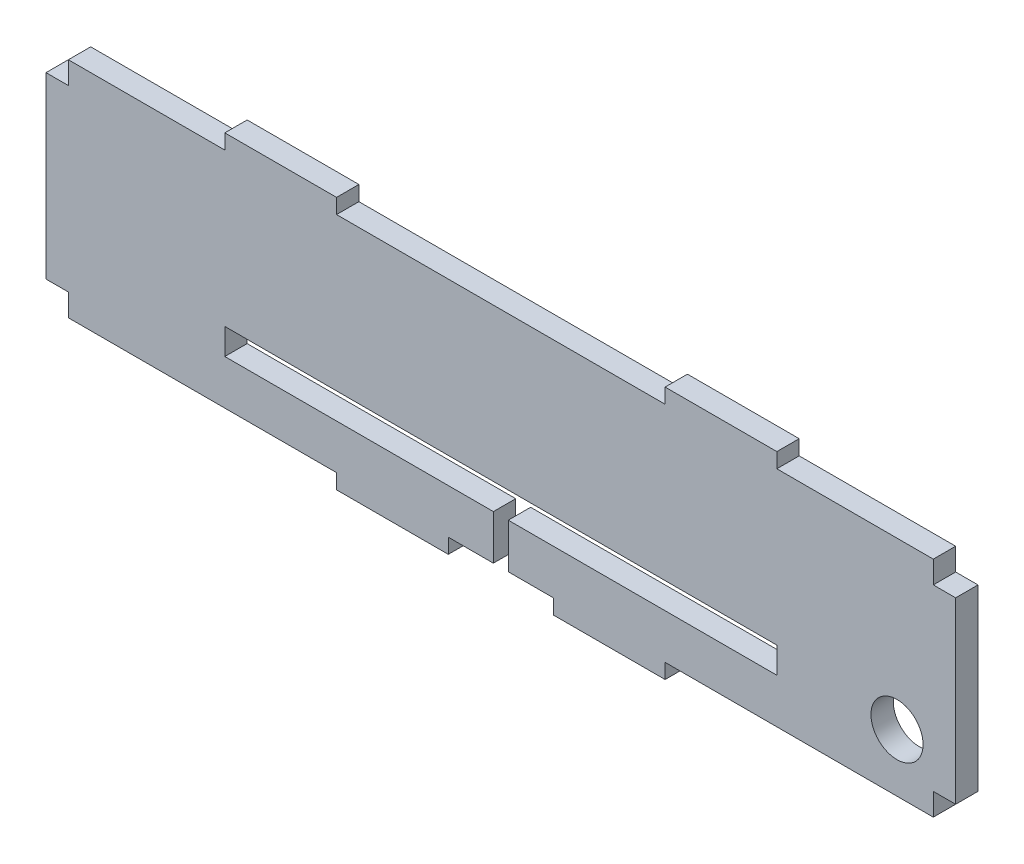
ISO-10303-21;
HEADER;
FILE_DESCRIPTION(('STEP AP214'),'2;1');
FILE_NAME('part.step','',(''),(''),'','','');
FILE_SCHEMA(('AUTOMOTIVE_DESIGN { 1 0 10303 214 1 1 1 1 }'));
ENDSEC;
DATA;
#1=APPLICATION_CONTEXT('core data for automotive mechanical design processes');
#2=APPLICATION_PROTOCOL_DEFINITION('international standard','automotive_design',2000,#1);
#3=PRODUCT_CONTEXT('',#1,'mechanical');
#4=PRODUCT('Part','Part','',(#3));
#5=PRODUCT_RELATED_PRODUCT_CATEGORY('part','',(#4));
#6=PRODUCT_DEFINITION_FORMATION('','',#4);
#7=PRODUCT_DEFINITION_CONTEXT('part definition',#1,'design');
#8=PRODUCT_DEFINITION('design','',#6,#7);
#9=PRODUCT_DEFINITION_SHAPE('','',#8);
#10=(LENGTH_UNIT() NAMED_UNIT(*) SI_UNIT(.MILLI.,.METRE.));
#11=(NAMED_UNIT(*) PLANE_ANGLE_UNIT() SI_UNIT($,.RADIAN.));
#12=(NAMED_UNIT(*) SI_UNIT($,.STERADIAN.) SOLID_ANGLE_UNIT());
#13=UNCERTAINTY_MEASURE_WITH_UNIT(LENGTH_MEASURE(1.E-05),#10,'distance_accuracy_value','');
#14=(GEOMETRIC_REPRESENTATION_CONTEXT(3) GLOBAL_UNCERTAINTY_ASSIGNED_CONTEXT((#13)) GLOBAL_UNIT_ASSIGNED_CONTEXT((#10,
#11,#12)) REPRESENTATION_CONTEXT('',''));
#15=CARTESIAN_POINT('',(0.,0.,0.));
#16=DIRECTION('',(0.,0.,1.));
#17=DIRECTION('',(1.,0.,0.));
#18=AXIS2_PLACEMENT_3D('',#15,#16,#17);
#19=CARTESIAN_POINT('',(0.,30.,3.));
#20=DIRECTION('',(0.,1.,0.));
#21=DIRECTION('',(0.,0.,1.));
#22=AXIS2_PLACEMENT_3D('',#19,#20,#21);
#23=PLANE('',#22);
#24=DIRECTION('',(1.,0.,0.));
#25=VECTOR('',#24,1.);
#26=CARTESIAN_POINT('',(0.,30.,0.));
#27=LINE('',#26,#25);
#28=CARTESIAN_POINT('',(6.00000000000002,30.,0.));
#29=VERTEX_POINT('',#28);
#30=CARTESIAN_POINT('',(27.,30.,0.));
#31=VERTEX_POINT('',#30);
#32=EDGE_CURVE('E388',#29,#31,#27,.T.);
#33=ORIENTED_EDGE('',*,*,#32,.F.);
#34=DIRECTION('',(0.,0.,-1.));
#35=VECTOR('',#34,1.);
#36=CARTESIAN_POINT('',(6.00000000000002,30.,3.));
#37=LINE('',#36,#35);
#38=CARTESIAN_POINT('',(6.00000000000002,30.,3.));
#39=VERTEX_POINT('',#38);
#40=EDGE_CURVE('E11',#39,#29,#37,.T.);
#41=ORIENTED_EDGE('',*,*,#40,.F.);
#42=DIRECTION('',(1.,0.,0.));
#43=VECTOR('',#42,1.);
#44=CARTESIAN_POINT('',(0.,30.,3.));
#45=LINE('',#44,#43);
#46=CARTESIAN_POINT('',(27.,30.,3.));
#47=VERTEX_POINT('',#46);
#48=EDGE_CURVE('E1069',#39,#47,#45,.T.);
#49=ORIENTED_EDGE('',*,*,#48,.T.);
#50=DIRECTION('',(0.,0.,-1.));
#51=VECTOR('',#50,1.);
#52=CARTESIAN_POINT('',(27.,30.,3.));
#53=LINE('',#52,#51);
#54=EDGE_CURVE('E53',#47,#31,#53,.T.);
#55=ORIENTED_EDGE('',*,*,#54,.T.);
#56=EDGE_LOOP('',(#33,#41,#49,#55));
#57=FACE_BOUND('',#56,.T.);
#58=ADVANCED_FACE('F36',(#57),#23,.T.);
#59=CARTESIAN_POINT('',(6.00000000000002,0.,3.));
#60=DIRECTION('',(1.,0.,0.));
#61=DIRECTION('',(0.,0.,-1.));
#62=AXIS2_PLACEMENT_3D('',#59,#60,#61);
#63=PLANE('',#62);
#64=DIRECTION('',(0.,-1.,0.));
#65=VECTOR('',#64,1.);
#66=CARTESIAN_POINT('',(6.00000000000002,0.,0.));
#67=LINE('',#66,#65);
#68=CARTESIAN_POINT('',(6.00000000000002,27.,0.));
#69=VERTEX_POINT('',#68);
#70=EDGE_CURVE('E385',#29,#69,#67,.T.);
#71=ORIENTED_EDGE('',*,*,#70,.T.);
#72=DIRECTION('',(0.,0.,-1.));
#73=VECTOR('',#72,1.);
#74=CARTESIAN_POINT('',(6.00000000000002,27.,3.));
#75=LINE('',#74,#73);
#76=CARTESIAN_POINT('',(6.00000000000002,27.,3.));
#77=VERTEX_POINT('',#76);
#78=EDGE_CURVE('E45',#77,#69,#75,.T.);
#79=ORIENTED_EDGE('',*,*,#78,.F.);
#80=DIRECTION('',(0.,-1.,0.));
#81=VECTOR('',#80,1.);
#82=CARTESIAN_POINT('',(6.00000000000002,0.,3.));
#83=LINE('',#82,#81);
#84=EDGE_CURVE('E1067',#39,#77,#83,.T.);
#85=ORIENTED_EDGE('',*,*,#84,.F.);
#86=ORIENTED_EDGE('',*,*,#40,.T.);
#87=EDGE_LOOP('',(#71,#79,#85,#86));
#88=FACE_BOUND('',#87,.T.);
#89=ADVANCED_FACE('F386',(#88),#63,.F.);
#90=CARTESIAN_POINT('',(0.,27.,3.));
#91=DIRECTION('',(0.,1.,0.));
#92=DIRECTION('',(0.,0.,1.));
#93=AXIS2_PLACEMENT_3D('',#90,#91,#92);
#94=PLANE('',#93);
#95=DIRECTION('',(1.,0.,0.));
#96=VECTOR('',#95,1.);
#97=CARTESIAN_POINT('',(0.,27.,0.));
#98=LINE('',#97,#96);
#99=CARTESIAN_POINT('',(3.00000000000002,27.,0.));
#100=VERTEX_POINT('',#99);
#101=EDGE_CURVE('E379',#100,#69,#98,.T.);
#102=ORIENTED_EDGE('',*,*,#101,.F.);
#103=DIRECTION('',(0.,0.,-1.));
#104=VECTOR('',#103,1.);
#105=CARTESIAN_POINT('',(3.00000000000002,27.,3.));
#106=LINE('',#105,#104);
#107=CARTESIAN_POINT('',(3.00000000000002,27.,3.));
#108=VERTEX_POINT('',#107);
#109=EDGE_CURVE('E371',#108,#100,#106,.T.);
#110=ORIENTED_EDGE('',*,*,#109,.F.);
#111=DIRECTION('',(1.,0.,0.));
#112=VECTOR('',#111,1.);
#113=CARTESIAN_POINT('',(0.,27.,3.));
#114=LINE('',#113,#112);
#115=EDGE_CURVE('E382',#108,#77,#114,.T.);
#116=ORIENTED_EDGE('',*,*,#115,.T.);
#117=ORIENTED_EDGE('',*,*,#78,.T.);
#118=EDGE_LOOP('',(#102,#110,#116,#117));
#119=FACE_BOUND('',#118,.T.);
#120=ADVANCED_FACE('F377',(#119),#94,.T.);
#121=CARTESIAN_POINT('',(3.00000000000002,0.,3.));
#122=DIRECTION('',(-1.,0.,0.));
#123=DIRECTION('',(0.,0.,1.));
#124=AXIS2_PLACEMENT_3D('',#121,#122,#123);
#125=PLANE('',#124);
#126=DIRECTION('',(0.,1.,0.));
#127=VECTOR('',#126,1.);
#128=CARTESIAN_POINT('',(3.00000000000002,0.,0.));
#129=LINE('',#128,#127);
#130=CARTESIAN_POINT('',(3.00000000000002,3.,0.));
#131=VERTEX_POINT('',#130);
#132=EDGE_CURVE('E393',#131,#100,#129,.T.);
#133=ORIENTED_EDGE('',*,*,#132,.F.);
#134=DIRECTION('',(0.,0.,-1.));
#135=VECTOR('',#134,1.);
#136=CARTESIAN_POINT('',(3.00000000000002,3.,3.));
#137=LINE('',#136,#135);
#138=CARTESIAN_POINT('',(3.00000000000002,3.,3.));
#139=VERTEX_POINT('',#138);
#140=EDGE_CURVE('E369',#139,#131,#137,.T.);
#141=ORIENTED_EDGE('',*,*,#140,.F.);
#142=DIRECTION('',(0.,1.,0.));
#143=VECTOR('',#142,1.);
#144=CARTESIAN_POINT('',(3.00000000000002,0.,3.));
#145=LINE('',#144,#143);
#146=EDGE_CURVE('E1063',#139,#108,#145,.T.);
#147=ORIENTED_EDGE('',*,*,#146,.T.);
#148=ORIENTED_EDGE('',*,*,#109,.T.);
#149=EDGE_LOOP('',(#133,#141,#147,#148));
#150=FACE_BOUND('',#149,.T.);
#151=ADVANCED_FACE('F513',(#150),#125,.T.);
#152=CARTESIAN_POINT('',(0.,3.,3.));
#153=DIRECTION('',(0.,1.,0.));
#154=DIRECTION('',(0.,0.,1.));
#155=AXIS2_PLACEMENT_3D('',#152,#153,#154);
#156=PLANE('',#155);
#157=DIRECTION('',(1.,0.,0.));
#158=VECTOR('',#157,1.);
#159=CARTESIAN_POINT('',(0.,3.,0.));
#160=LINE('',#159,#158);
#161=CARTESIAN_POINT('',(6.00000000000002,3.,0.));
#162=VERTEX_POINT('',#161);
#163=EDGE_CURVE('E395',#131,#162,#160,.T.);
#164=ORIENTED_EDGE('',*,*,#163,.T.);
#165=DIRECTION('',(0.,0.,-1.));
#166=VECTOR('',#165,1.);
#167=CARTESIAN_POINT('',(6.00000000000002,3.,3.));
#168=LINE('',#167,#166);
#169=CARTESIAN_POINT('',(6.00000000000002,3.,3.));
#170=VERTEX_POINT('',#169);
#171=EDGE_CURVE('E367',#170,#162,#168,.T.);
#172=ORIENTED_EDGE('',*,*,#171,.F.);
#173=DIRECTION('',(1.,0.,0.));
#174=VECTOR('',#173,1.);
#175=CARTESIAN_POINT('',(0.,3.,3.));
#176=LINE('',#175,#174);
#177=EDGE_CURVE('E1061',#139,#170,#176,.T.);
#178=ORIENTED_EDGE('',*,*,#177,.F.);
#179=ORIENTED_EDGE('',*,*,#140,.T.);
#180=EDGE_LOOP('',(#164,#172,#178,#179));
#181=FACE_BOUND('',#180,.T.);
#182=ADVANCED_FACE('F516',(#181),#156,.F.);
#183=CARTESIAN_POINT('',(6.00000000000002,0.,3.));
#184=DIRECTION('',(-1.,0.,0.));
#185=DIRECTION('',(0.,0.,1.));
#186=AXIS2_PLACEMENT_3D('',#183,#184,#185);
#187=PLANE('',#186);
#188=DIRECTION('',(0.,1.,0.));
#189=VECTOR('',#188,1.);
#190=CARTESIAN_POINT('',(6.00000000000002,0.,0.));
#191=LINE('',#190,#189);
#192=CARTESIAN_POINT('',(6.00000000000002,0.,0.));
#193=VERTEX_POINT('',#192);
#194=EDGE_CURVE('E401',#193,#162,#191,.T.);
#195=ORIENTED_EDGE('',*,*,#194,.F.);
#196=DIRECTION('',(0.,0.,-1.));
#197=VECTOR('',#196,1.);
#198=CARTESIAN_POINT('',(6.00000000000002,0.,3.));
#199=LINE('',#198,#197);
#200=CARTESIAN_POINT('',(6.00000000000002,0.,3.));
#201=VERTEX_POINT('',#200);
#202=EDGE_CURVE('E365',#201,#193,#199,.T.);
#203=ORIENTED_EDGE('',*,*,#202,.F.);
#204=DIRECTION('',(0.,1.,0.));
#205=VECTOR('',#204,1.);
#206=CARTESIAN_POINT('',(6.00000000000002,0.,3.));
#207=LINE('',#206,#205);
#208=EDGE_CURVE('E1058',#201,#170,#207,.T.);
#209=ORIENTED_EDGE('',*,*,#208,.T.);
#210=ORIENTED_EDGE('',*,*,#171,.T.);
#211=EDGE_LOOP('',(#195,#203,#209,#210));
#212=FACE_BOUND('',#211,.T.);
#213=ADVANCED_FACE('F520',(#212),#187,.T.);
#214=CARTESIAN_POINT('',(0.,0.,3.));
#215=DIRECTION('',(0.,1.,0.));
#216=DIRECTION('',(0.,0.,1.));
#217=AXIS2_PLACEMENT_3D('',#214,#215,#216);
#218=PLANE('',#217);
#219=DIRECTION('',(1.,0.,0.));
#220=VECTOR('',#219,1.);
#221=CARTESIAN_POINT('',(0.,0.,0.));
#222=LINE('',#221,#220);
#223=CARTESIAN_POINT('',(42.,0.,0.));
#224=VERTEX_POINT('',#223);
#225=EDGE_CURVE('E404',#193,#224,#222,.T.);
#226=ORIENTED_EDGE('',*,*,#225,.T.);
#227=DIRECTION('',(0.,0.,-1.));
#228=VECTOR('',#227,1.);
#229=CARTESIAN_POINT('',(42.,0.,3.));
#230=LINE('',#229,#228);
#231=CARTESIAN_POINT('',(42.,0.,3.));
#232=VERTEX_POINT('',#231);
#233=EDGE_CURVE('E362',#232,#224,#230,.T.);
#234=ORIENTED_EDGE('',*,*,#233,.F.);
#235=DIRECTION('',(1.,0.,0.));
#236=VECTOR('',#235,1.);
#237=CARTESIAN_POINT('',(0.,0.,3.));
#238=LINE('',#237,#236);
#239=EDGE_CURVE('E1055',#201,#232,#238,.T.);
#240=ORIENTED_EDGE('',*,*,#239,.F.);
#241=ORIENTED_EDGE('',*,*,#202,.T.);
#242=EDGE_LOOP('',(#226,#234,#240,#241));
#243=FACE_BOUND('',#242,.T.);
#244=ADVANCED_FACE('F524',(#243),#218,.F.);
#245=CARTESIAN_POINT('',(42.,2.91433543964104E-13,3.));
#246=DIRECTION('',(1.,0.,0.));
#247=DIRECTION('',(0.,1.,0.));
#248=AXIS2_PLACEMENT_3D('',#245,#246,#247);
#249=PLANE('',#248);
#250=DIRECTION('',(0.,-1.,0.));
#251=VECTOR('',#250,1.);
#252=CARTESIAN_POINT('',(42.,2.91433543964104E-13,0.));
#253=LINE('',#252,#251);
#254=CARTESIAN_POINT('',(42.,-2.,0.));
#255=VERTEX_POINT('',#254);
#256=EDGE_CURVE('E407',#224,#255,#253,.T.);
#257=ORIENTED_EDGE('',*,*,#256,.T.);
#258=DIRECTION('',(0.,0.,-1.));
#259=VECTOR('',#258,1.);
#260=CARTESIAN_POINT('',(42.,-2.,3.));
#261=LINE('',#260,#259);
#262=CARTESIAN_POINT('',(42.,-2.,3.));
#263=VERTEX_POINT('',#262);
#264=EDGE_CURVE('E359',#263,#255,#261,.T.);
#265=ORIENTED_EDGE('',*,*,#264,.F.);
#266=DIRECTION('',(0.,-1.,0.));
#267=VECTOR('',#266,1.);
#268=CARTESIAN_POINT('',(42.,2.91433543964104E-13,3.));
#269=LINE('',#268,#267);
#270=EDGE_CURVE('E1052',#232,#263,#269,.T.);
#271=ORIENTED_EDGE('',*,*,#270,.F.);
#272=ORIENTED_EDGE('',*,*,#233,.T.);
#273=EDGE_LOOP('',(#257,#265,#271,#272));
#274=FACE_BOUND('',#273,.T.);
#275=ADVANCED_FACE('F528',(#274),#249,.F.);
#276=CARTESIAN_POINT('',(0.,-2.,3.));
#277=DIRECTION('',(0.,1.,0.));
#278=DIRECTION('',(-1.,0.,0.));
#279=AXIS2_PLACEMENT_3D('',#276,#277,#278);
#280=PLANE('',#279);
#281=DIRECTION('',(1.,0.,0.));
#282=VECTOR('',#281,1.);
#283=CARTESIAN_POINT('',(0.,-2.,0.));
#284=LINE('',#283,#282);
#285=CARTESIAN_POINT('',(57.,-2.,0.));
#286=VERTEX_POINT('',#285);
#287=EDGE_CURVE('E410',#255,#286,#284,.T.);
#288=ORIENTED_EDGE('',*,*,#287,.T.);
#289=DIRECTION('',(0.,0.,-1.));
#290=VECTOR('',#289,1.);
#291=CARTESIAN_POINT('',(57.,-2.,3.));
#292=LINE('',#291,#290);
#293=CARTESIAN_POINT('',(57.,-2.,3.));
#294=VERTEX_POINT('',#293);
#295=EDGE_CURVE('E356',#294,#286,#292,.T.);
#296=ORIENTED_EDGE('',*,*,#295,.F.);
#297=DIRECTION('',(1.,0.,0.));
#298=VECTOR('',#297,1.);
#299=CARTESIAN_POINT('',(0.,-2.,3.));
#300=LINE('',#299,#298);
#301=EDGE_CURVE('E960',#263,#294,#300,.T.);
#302=ORIENTED_EDGE('',*,*,#301,.F.);
#303=ORIENTED_EDGE('',*,*,#264,.T.);
#304=EDGE_LOOP('',(#288,#296,#302,#303));
#305=FACE_BOUND('',#304,.T.);
#306=ADVANCED_FACE('F532',(#305),#280,.F.);
#307=CARTESIAN_POINT('',(57.,0.,3.));
#308=DIRECTION('',(-1.,0.,0.));
#309=DIRECTION('',(0.,0.,1.));
#310=AXIS2_PLACEMENT_3D('',#307,#308,#309);
#311=PLANE('',#310);
#312=DIRECTION('',(0.,1.,0.));
#313=VECTOR('',#312,1.);
#314=CARTESIAN_POINT('',(57.,0.,0.));
#315=LINE('',#314,#313);
#316=CARTESIAN_POINT('',(57.,0.,0.));
#317=VERTEX_POINT('',#316);
#318=EDGE_CURVE('E413',#286,#317,#315,.T.);
#319=ORIENTED_EDGE('',*,*,#318,.T.);
#320=DIRECTION('',(0.,0.,-1.));
#321=VECTOR('',#320,1.);
#322=CARTESIAN_POINT('',(57.,0.,3.));
#323=LINE('',#322,#321);
#324=CARTESIAN_POINT('',(57.,0.,3.));
#325=VERTEX_POINT('',#324);
#326=EDGE_CURVE('E353',#325,#317,#323,.T.);
#327=ORIENTED_EDGE('',*,*,#326,.F.);
#328=DIRECTION('',(0.,1.,0.));
#329=VECTOR('',#328,1.);
#330=CARTESIAN_POINT('',(57.,0.,3.));
#331=LINE('',#330,#329);
#332=EDGE_CURVE('E957',#294,#325,#331,.T.);
#333=ORIENTED_EDGE('',*,*,#332,.F.);
#334=ORIENTED_EDGE('',*,*,#295,.T.);
#335=EDGE_LOOP('',(#319,#327,#333,#334));
#336=FACE_BOUND('',#335,.T.);
#337=ADVANCED_FACE('F536',(#336),#311,.F.);
#338=CARTESIAN_POINT('',(0.,0.,3.));
#339=DIRECTION('',(0.,1.,0.));
#340=DIRECTION('',(-1.,0.,0.));
#341=AXIS2_PLACEMENT_3D('',#338,#339,#340);
#342=PLANE('',#341);
#343=DIRECTION('',(1.,0.,0.));
#344=VECTOR('',#343,1.);
#345=CARTESIAN_POINT('',(0.,0.,0.));
#346=LINE('',#345,#344);
#347=CARTESIAN_POINT('',(63.05,0.,0.));
#348=VERTEX_POINT('',#347);
#349=EDGE_CURVE('E416',#317,#348,#346,.T.);
#350=ORIENTED_EDGE('',*,*,#349,.T.);
#351=DIRECTION('',(0.,0.,-1.));
#352=VECTOR('',#351,1.);
#353=CARTESIAN_POINT('',(63.05,0.,3.));
#354=LINE('',#353,#352);
#355=CARTESIAN_POINT('',(63.05,0.,3.));
#356=VERTEX_POINT('',#355);
#357=EDGE_CURVE('E350',#356,#348,#354,.T.);
#358=ORIENTED_EDGE('',*,*,#357,.F.);
#359=DIRECTION('',(1.,0.,0.));
#360=VECTOR('',#359,1.);
#361=CARTESIAN_POINT('',(0.,0.,3.));
#362=LINE('',#361,#360);
#363=EDGE_CURVE('E953',#325,#356,#362,.T.);
#364=ORIENTED_EDGE('',*,*,#363,.F.);
#365=ORIENTED_EDGE('',*,*,#326,.T.);
#366=EDGE_LOOP('',(#350,#358,#364,#365));
#367=FACE_BOUND('',#366,.T.);
#368=ADVANCED_FACE('F540',(#367),#342,.F.);
#369=CARTESIAN_POINT('',(63.05,0.,3.));
#370=DIRECTION('',(-1.,0.,0.));
#371=DIRECTION('',(0.,0.,1.));
#372=AXIS2_PLACEMENT_3D('',#369,#370,#371);
#373=PLANE('',#372);
#374=DIRECTION('',(0.,1.,0.));
#375=VECTOR('',#374,1.);
#376=CARTESIAN_POINT('',(63.05,0.,0.));
#377=LINE('',#376,#375);
#378=CARTESIAN_POINT('',(63.05,6.,0.));
#379=VERTEX_POINT('',#378);
#380=EDGE_CURVE('E419',#348,#379,#377,.T.);
#381=ORIENTED_EDGE('',*,*,#380,.T.);
#382=DIRECTION('',(0.,0.,-1.));
#383=VECTOR('',#382,1.);
#384=CARTESIAN_POINT('',(63.05,6.,3.));
#385=LINE('',#384,#383);
#386=CARTESIAN_POINT('',(63.05,6.,3.));
#387=VERTEX_POINT('',#386);
#388=EDGE_CURVE('E348',#387,#379,#385,.T.);
#389=ORIENTED_EDGE('',*,*,#388,.F.);
#390=DIRECTION('',(0.,1.,0.));
#391=VECTOR('',#390,1.);
#392=CARTESIAN_POINT('',(63.05,0.,3.));
#393=LINE('',#392,#391);
#394=EDGE_CURVE('E948',#356,#387,#393,.T.);
#395=ORIENTED_EDGE('',*,*,#394,.F.);
#396=ORIENTED_EDGE('',*,*,#357,.T.);
#397=EDGE_LOOP('',(#381,#389,#395,#396));
#398=FACE_BOUND('',#397,.T.);
#399=ADVANCED_FACE('F542',(#398),#373,.F.);
#400=CARTESIAN_POINT('',(0.,6.,3.));
#401=DIRECTION('',(0.,1.,0.));
#402=DIRECTION('',(0.,0.,1.));
#403=AXIS2_PLACEMENT_3D('',#400,#401,#402);
#404=PLANE('',#403);
#405=DIRECTION('',(1.,0.,0.));
#406=VECTOR('',#405,1.);
#407=CARTESIAN_POINT('',(0.,6.,0.));
#408=LINE('',#407,#406);
#409=CARTESIAN_POINT('',(27.,6.,0.));
#410=VERTEX_POINT('',#409);
#411=EDGE_CURVE('E423',#410,#379,#408,.T.);
#412=ORIENTED_EDGE('',*,*,#411,.F.);
#413=DIRECTION('',(0.,0.,-1.));
#414=VECTOR('',#413,1.);
#415=CARTESIAN_POINT('',(27.,6.,3.));
#416=LINE('',#415,#414);
#417=CARTESIAN_POINT('',(27.,6.,3.));
#418=VERTEX_POINT('',#417);
#419=EDGE_CURVE('E346',#418,#410,#416,.T.);
#420=ORIENTED_EDGE('',*,*,#419,.F.);
#421=DIRECTION('',(1.,0.,0.));
#422=VECTOR('',#421,1.);
#423=CARTESIAN_POINT('',(0.,6.,3.));
#424=LINE('',#423,#422);
#425=EDGE_CURVE('E952',#418,#387,#424,.T.);
#426=ORIENTED_EDGE('',*,*,#425,.T.);
#427=ORIENTED_EDGE('',*,*,#388,.T.);
#428=EDGE_LOOP('',(#412,#420,#426,#427));
#429=FACE_BOUND('',#428,.T.);
#430=ADVANCED_FACE('F545',(#429),#404,.T.);
#431=CARTESIAN_POINT('',(27.,0.,3.));
#432=DIRECTION('',(1.,0.,0.));
#433=DIRECTION('',(0.,0.,-1.));
#434=AXIS2_PLACEMENT_3D('',#431,#432,#433);
#435=PLANE('',#434);
#436=DIRECTION('',(0.,-1.,0.));
#437=VECTOR('',#436,1.);
#438=CARTESIAN_POINT('',(27.,0.,0.));
#439=LINE('',#438,#437);
#440=CARTESIAN_POINT('',(27.,9.5,0.));
#441=VERTEX_POINT('',#440);
#442=EDGE_CURVE('E426',#441,#410,#439,.T.);
#443=ORIENTED_EDGE('',*,*,#442,.F.);
#444=DIRECTION('',(0.,0.,-1.));
#445=VECTOR('',#444,1.);
#446=CARTESIAN_POINT('',(27.,9.5,3.));
#447=LINE('',#446,#445);
#448=CARTESIAN_POINT('',(27.,9.5,3.));
#449=VERTEX_POINT('',#448);
#450=EDGE_CURVE('E344',#449,#441,#447,.T.);
#451=ORIENTED_EDGE('',*,*,#450,.F.);
#452=DIRECTION('',(0.,-1.,0.));
#453=VECTOR('',#452,1.);
#454=CARTESIAN_POINT('',(27.,0.,3.));
#455=LINE('',#454,#453);
#456=EDGE_CURVE('E1045',#449,#418,#455,.T.);
#457=ORIENTED_EDGE('',*,*,#456,.T.);
#458=ORIENTED_EDGE('',*,*,#419,.T.);
#459=EDGE_LOOP('',(#443,#451,#457,#458));
#460=FACE_BOUND('',#459,.T.);
#461=ADVANCED_FACE('F549',(#460),#435,.T.);
#462=CARTESIAN_POINT('',(0.,9.5,3.));
#463=DIRECTION('',(0.,1.,0.));
#464=DIRECTION('',(0.,0.,1.));
#465=AXIS2_PLACEMENT_3D('',#462,#463,#464);
#466=PLANE('',#465);
#467=DIRECTION('',(1.,0.,0.));
#468=VECTOR('',#467,1.);
#469=CARTESIAN_POINT('',(0.,9.5,0.));
#470=LINE('',#469,#468);
#471=CARTESIAN_POINT('',(101.1,9.5,0.));
#472=VERTEX_POINT('',#471);
#473=EDGE_CURVE('E429',#441,#472,#470,.T.);
#474=ORIENTED_EDGE('',*,*,#473,.T.);
#475=DIRECTION('',(0.,0.,-1.));
#476=VECTOR('',#475,1.);
#477=CARTESIAN_POINT('',(101.1,9.5,3.));
#478=LINE('',#477,#476);
#479=CARTESIAN_POINT('',(101.1,9.5,3.));
#480=VERTEX_POINT('',#479);
#481=EDGE_CURVE('E341',#480,#472,#478,.T.);
#482=ORIENTED_EDGE('',*,*,#481,.F.);
#483=DIRECTION('',(1.,0.,0.));
#484=VECTOR('',#483,1.);
#485=CARTESIAN_POINT('',(0.,9.5,3.));
#486=LINE('',#485,#484);
#487=EDGE_CURVE('E1047',#449,#480,#486,.T.);
#488=ORIENTED_EDGE('',*,*,#487,.F.);
#489=ORIENTED_EDGE('',*,*,#450,.T.);
#490=EDGE_LOOP('',(#474,#482,#488,#489));
#491=FACE_BOUND('',#490,.T.);
#492=ADVANCED_FACE('F553',(#491),#466,.F.);
#493=CARTESIAN_POINT('',(101.1,-4.00869813534298E-13,3.));
#494=DIRECTION('',(1.,0.,0.));
#495=DIRECTION('',(0.,1.,0.));
#496=AXIS2_PLACEMENT_3D('',#493,#494,#495);
#497=PLANE('',#496);
#498=DIRECTION('',(0.,-1.,0.));
#499=VECTOR('',#498,1.);
#500=CARTESIAN_POINT('',(101.1,-4.00869813534298E-13,0.));
#501=LINE('',#500,#499);
#502=CARTESIAN_POINT('',(101.1,6.,0.));
#503=VERTEX_POINT('',#502);
#504=EDGE_CURVE('E432',#472,#503,#501,.T.);
#505=ORIENTED_EDGE('',*,*,#504,.T.);
#506=DIRECTION('',(0.,0.,-1.));
#507=VECTOR('',#506,1.);
#508=CARTESIAN_POINT('',(101.1,6.,3.));
#509=LINE('',#508,#507);
#510=CARTESIAN_POINT('',(101.1,6.,3.));
#511=VERTEX_POINT('',#510);
#512=EDGE_CURVE('E339',#511,#503,#509,.T.);
#513=ORIENTED_EDGE('',*,*,#512,.F.);
#514=DIRECTION('',(0.,-1.,0.));
#515=VECTOR('',#514,1.);
#516=CARTESIAN_POINT('',(101.1,-4.00869813534298E-13,3.));
#517=LINE('',#516,#515);
#518=EDGE_CURVE('E975',#480,#511,#517,.T.);
#519=ORIENTED_EDGE('',*,*,#518,.F.);
#520=ORIENTED_EDGE('',*,*,#481,.T.);
#521=EDGE_LOOP('',(#505,#513,#519,#520));
#522=FACE_BOUND('',#521,.T.);
#523=ADVANCED_FACE('F557',(#522),#497,.F.);
#524=CARTESIAN_POINT('',(0.,6.,3.));
#525=DIRECTION('',(0.,1.,0.));
#526=DIRECTION('',(0.,0.,1.));
#527=AXIS2_PLACEMENT_3D('',#524,#525,#526);
#528=PLANE('',#527);
#529=DIRECTION('',(1.,0.,0.));
#530=VECTOR('',#529,1.);
#531=CARTESIAN_POINT('',(0.,6.,0.));
#532=LINE('',#531,#530);
#533=CARTESIAN_POINT('',(65.05,6.,0.));
#534=VERTEX_POINT('',#533);
#535=EDGE_CURVE('E435',#534,#503,#532,.T.);
#536=ORIENTED_EDGE('',*,*,#535,.F.);
#537=DIRECTION('',(0.,0.,-1.));
#538=VECTOR('',#537,1.);
#539=CARTESIAN_POINT('',(65.05,6.,3.));
#540=LINE('',#539,#538);
#541=CARTESIAN_POINT('',(65.05,6.,3.));
#542=VERTEX_POINT('',#541);
#543=EDGE_CURVE('E337',#542,#534,#540,.T.);
#544=ORIENTED_EDGE('',*,*,#543,.F.);
#545=DIRECTION('',(1.,0.,0.));
#546=VECTOR('',#545,1.);
#547=CARTESIAN_POINT('',(0.,6.,3.));
#548=LINE('',#547,#546);
#549=EDGE_CURVE('E972',#542,#511,#548,.T.);
#550=ORIENTED_EDGE('',*,*,#549,.T.);
#551=ORIENTED_EDGE('',*,*,#512,.T.);
#552=EDGE_LOOP('',(#536,#544,#550,#551));
#553=FACE_BOUND('',#552,.T.);
#554=ADVANCED_FACE('F561',(#553),#528,.T.);
#555=CARTESIAN_POINT('',(65.05,0.,3.));
#556=DIRECTION('',(-1.,0.,0.));
#557=DIRECTION('',(0.,0.,1.));
#558=AXIS2_PLACEMENT_3D('',#555,#556,#557);
#559=PLANE('',#558);
#560=DIRECTION('',(0.,1.,0.));
#561=VECTOR('',#560,1.);
#562=CARTESIAN_POINT('',(65.05,0.,0.));
#563=LINE('',#562,#561);
#564=CARTESIAN_POINT('',(65.05,0.,0.));
#565=VERTEX_POINT('',#564);
#566=EDGE_CURVE('E438',#565,#534,#563,.T.);
#567=ORIENTED_EDGE('',*,*,#566,.F.);
#568=DIRECTION('',(0.,0.,-1.));
#569=VECTOR('',#568,1.);
#570=CARTESIAN_POINT('',(65.05,0.,3.));
#571=LINE('',#570,#569);
#572=CARTESIAN_POINT('',(65.05,0.,3.));
#573=VERTEX_POINT('',#572);
#574=EDGE_CURVE('E335',#573,#565,#571,.T.);
#575=ORIENTED_EDGE('',*,*,#574,.F.);
#576=DIRECTION('',(0.,1.,0.));
#577=VECTOR('',#576,1.);
#578=CARTESIAN_POINT('',(65.05,0.,3.));
#579=LINE('',#578,#577);
#580=EDGE_CURVE('E964',#573,#542,#579,.T.);
#581=ORIENTED_EDGE('',*,*,#580,.T.);
#582=ORIENTED_EDGE('',*,*,#543,.T.);
#583=EDGE_LOOP('',(#567,#575,#581,#582));
#584=FACE_BOUND('',#583,.T.);
#585=ADVANCED_FACE('F565',(#584),#559,.T.);
#586=CARTESIAN_POINT('',(71.1,0.,0.));
#587=VERTEX_POINT('',#586);
#588=EDGE_CURVE('E420',#565,#587,#346,.T.);
#589=ORIENTED_EDGE('',*,*,#588,.T.);
#590=DIRECTION('',(0.,0.,-1.));
#591=VECTOR('',#590,1.);
#592=CARTESIAN_POINT('',(71.1,0.,3.));
#593=LINE('',#592,#591);
#594=CARTESIAN_POINT('',(71.1,0.,3.));
#595=VERTEX_POINT('',#594);
#596=EDGE_CURVE('E332',#595,#587,#593,.T.);
#597=ORIENTED_EDGE('',*,*,#596,.F.);
#598=EDGE_CURVE('E959',#573,#595,#362,.T.);
#599=ORIENTED_EDGE('',*,*,#598,.F.);
#600=ORIENTED_EDGE('',*,*,#574,.T.);
#601=EDGE_LOOP('',(#589,#597,#599,#600));
#602=FACE_BOUND('',#601,.T.);
#603=ADVANCED_FACE('F569',(#602),#342,.F.);
#604=CARTESIAN_POINT('',(71.1,0.,3.));
#605=DIRECTION('',(1.,0.,0.));
#606=DIRECTION('',(0.,0.,-1.));
#607=AXIS2_PLACEMENT_3D('',#604,#605,#606);
#608=PLANE('',#607);
#609=DIRECTION('',(0.,-1.,0.));
#610=VECTOR('',#609,1.);
#611=CARTESIAN_POINT('',(71.1,0.,0.));
#612=LINE('',#611,#610);
#613=CARTESIAN_POINT('',(71.1,-1.99999999999999,0.));
#614=VERTEX_POINT('',#613);
#615=EDGE_CURVE('E441',#587,#614,#612,.T.);
#616=ORIENTED_EDGE('',*,*,#615,.T.);
#617=DIRECTION('',(0.,0.,-1.));
#618=VECTOR('',#617,1.);
#619=CARTESIAN_POINT('',(71.1,-1.99999999999999,3.));
#620=LINE('',#619,#618);
#621=CARTESIAN_POINT('',(71.1,-1.99999999999999,3.));
#622=VERTEX_POINT('',#621);
#623=EDGE_CURVE('E329',#622,#614,#620,.T.);
#624=ORIENTED_EDGE('',*,*,#623,.F.);
#625=DIRECTION('',(0.,-1.,0.));
#626=VECTOR('',#625,1.);
#627=CARTESIAN_POINT('',(71.1,0.,3.));
#628=LINE('',#627,#626);
#629=EDGE_CURVE('E963',#595,#622,#628,.T.);
#630=ORIENTED_EDGE('',*,*,#629,.F.);
#631=ORIENTED_EDGE('',*,*,#596,.T.);
#632=EDGE_LOOP('',(#616,#624,#630,#631));
#633=FACE_BOUND('',#632,.T.);
#634=ADVANCED_FACE('F573',(#633),#608,.F.);
#635=CARTESIAN_POINT('',(0.,-2.,3.));
#636=DIRECTION('',(0.,1.,0.));
#637=DIRECTION('',(-1.,0.,0.));
#638=AXIS2_PLACEMENT_3D('',#635,#636,#637);
#639=PLANE('',#638);
#640=DIRECTION('',(1.,0.,0.));
#641=VECTOR('',#640,1.);
#642=CARTESIAN_POINT('',(0.,-2.,0.));
#643=LINE('',#642,#641);
#644=CARTESIAN_POINT('',(86.1,-1.99999999999998,0.));
#645=VERTEX_POINT('',#644);
#646=EDGE_CURVE('E444',#614,#645,#643,.T.);
#647=ORIENTED_EDGE('',*,*,#646,.T.);
#648=DIRECTION('',(0.,0.,-1.));
#649=VECTOR('',#648,1.);
#650=CARTESIAN_POINT('',(86.1,-1.99999999999998,3.));
#651=LINE('',#650,#649);
#652=CARTESIAN_POINT('',(86.1,-1.99999999999998,3.));
#653=VERTEX_POINT('',#652);
#654=EDGE_CURVE('E326',#653,#645,#651,.T.);
#655=ORIENTED_EDGE('',*,*,#654,.F.);
#656=DIRECTION('',(1.,0.,0.));
#657=VECTOR('',#656,1.);
#658=CARTESIAN_POINT('',(0.,-2.,3.));
#659=LINE('',#658,#657);
#660=EDGE_CURVE('E969',#622,#653,#659,.T.);
#661=ORIENTED_EDGE('',*,*,#660,.F.);
#662=ORIENTED_EDGE('',*,*,#623,.T.);
#663=EDGE_LOOP('',(#647,#655,#661,#662));
#664=FACE_BOUND('',#663,.T.);
#665=ADVANCED_FACE('F577',(#664),#639,.F.);
#666=CARTESIAN_POINT('',(86.1,0.,3.));
#667=DIRECTION('',(-1.,0.,0.));
#668=DIRECTION('',(0.,0.,1.));
#669=AXIS2_PLACEMENT_3D('',#666,#667,#668);
#670=PLANE('',#669);
#671=DIRECTION('',(0.,1.,0.));
#672=VECTOR('',#671,1.);
#673=CARTESIAN_POINT('',(86.1,0.,0.));
#674=LINE('',#673,#672);
#675=CARTESIAN_POINT('',(86.1,0.,0.));
#676=VERTEX_POINT('',#675);
#677=EDGE_CURVE('E447',#645,#676,#674,.T.);
#678=ORIENTED_EDGE('',*,*,#677,.T.);
#679=DIRECTION('',(0.,0.,-1.));
#680=VECTOR('',#679,1.);
#681=CARTESIAN_POINT('',(86.1,0.,3.));
#682=LINE('',#681,#680);
#683=CARTESIAN_POINT('',(86.1,0.,3.));
#684=VERTEX_POINT('',#683);
#685=EDGE_CURVE('E323',#684,#676,#682,.T.);
#686=ORIENTED_EDGE('',*,*,#685,.F.);
#687=DIRECTION('',(0.,1.,0.));
#688=VECTOR('',#687,1.);
#689=CARTESIAN_POINT('',(86.1,0.,3.));
#690=LINE('',#689,#688);
#691=EDGE_CURVE('E981',#653,#684,#690,.T.);
#692=ORIENTED_EDGE('',*,*,#691,.F.);
#693=ORIENTED_EDGE('',*,*,#654,.T.);
#694=EDGE_LOOP('',(#678,#686,#692,#693));
#695=FACE_BOUND('',#694,.T.);
#696=ADVANCED_FACE('F581',(#695),#670,.F.);
#697=CARTESIAN_POINT('',(0.,0.,3.));
#698=DIRECTION('',(0.,1.,0.));
#699=DIRECTION('',(-1.,0.,0.));
#700=AXIS2_PLACEMENT_3D('',#697,#698,#699);
#701=PLANE('',#700);
#702=DIRECTION('',(1.,0.,0.));
#703=VECTOR('',#702,1.);
#704=CARTESIAN_POINT('',(0.,0.,0.));
#705=LINE('',#704,#703);
#706=CARTESIAN_POINT('',(122.1,0.,0.));
#707=VERTEX_POINT('',#706);
#708=EDGE_CURVE('E450',#676,#707,#705,.T.);
#709=ORIENTED_EDGE('',*,*,#708,.T.);
#710=DIRECTION('',(0.,0.,-1.));
#711=VECTOR('',#710,1.);
#712=CARTESIAN_POINT('',(122.1,0.,3.));
#713=LINE('',#712,#711);
#714=CARTESIAN_POINT('',(122.1,0.,3.));
#715=VERTEX_POINT('',#714);
#716=EDGE_CURVE('E320',#715,#707,#713,.T.);
#717=ORIENTED_EDGE('',*,*,#716,.F.);
#718=DIRECTION('',(1.,0.,0.));
#719=VECTOR('',#718,1.);
#720=CARTESIAN_POINT('',(0.,0.,3.));
#721=LINE('',#720,#719);
#722=EDGE_CURVE('E984',#684,#715,#721,.T.);
#723=ORIENTED_EDGE('',*,*,#722,.F.);
#724=ORIENTED_EDGE('',*,*,#685,.T.);
#725=EDGE_LOOP('',(#709,#717,#723,#724));
#726=FACE_BOUND('',#725,.T.);
#727=ADVANCED_FACE('F585',(#726),#701,.F.);
#728=CARTESIAN_POINT('',(122.1,0.,3.));
#729=DIRECTION('',(-1.,0.,0.));
#730=DIRECTION('',(0.,0.,1.));
#731=AXIS2_PLACEMENT_3D('',#728,#729,#730);
#732=PLANE('',#731);
#733=DIRECTION('',(0.,1.,0.));
#734=VECTOR('',#733,1.);
#735=CARTESIAN_POINT('',(122.1,0.,0.));
#736=LINE('',#735,#734);
#737=CARTESIAN_POINT('',(122.1,3.,0.));
#738=VERTEX_POINT('',#737);
#739=EDGE_CURVE('E453',#707,#738,#736,.T.);
#740=ORIENTED_EDGE('',*,*,#739,.T.);
#741=DIRECTION('',(0.,0.,-1.));
#742=VECTOR('',#741,1.);
#743=CARTESIAN_POINT('',(122.1,3.,3.));
#744=LINE('',#743,#742);
#745=CARTESIAN_POINT('',(122.1,3.,3.));
#746=VERTEX_POINT('',#745);
#747=EDGE_CURVE('E318',#746,#738,#744,.T.);
#748=ORIENTED_EDGE('',*,*,#747,.F.);
#749=DIRECTION('',(0.,1.,0.));
#750=VECTOR('',#749,1.);
#751=CARTESIAN_POINT('',(122.1,0.,3.));
#752=LINE('',#751,#750);
#753=EDGE_CURVE('E987',#715,#746,#752,.T.);
#754=ORIENTED_EDGE('',*,*,#753,.F.);
#755=ORIENTED_EDGE('',*,*,#716,.T.);
#756=EDGE_LOOP('',(#740,#748,#754,#755));
#757=FACE_BOUND('',#756,.T.);
#758=ADVANCED_FACE('F589',(#757),#732,.F.);
#759=CARTESIAN_POINT('',(0.,3.,3.));
#760=DIRECTION('',(0.,-1.,0.));
#761=DIRECTION('',(0.,0.,-1.));
#762=AXIS2_PLACEMENT_3D('',#759,#760,#761);
#763=PLANE('',#762);
#764=DIRECTION('',(-1.,0.,0.));
#765=VECTOR('',#764,1.);
#766=CARTESIAN_POINT('',(0.,3.,0.));
#767=LINE('',#766,#765);
#768=CARTESIAN_POINT('',(125.1,3.,0.));
#769=VERTEX_POINT('',#768);
#770=EDGE_CURVE('E456',#769,#738,#767,.T.);
#771=ORIENTED_EDGE('',*,*,#770,.F.);
#772=DIRECTION('',(0.,0.,-1.));
#773=VECTOR('',#772,1.);
#774=CARTESIAN_POINT('',(125.1,3.,3.));
#775=LINE('',#774,#773);
#776=CARTESIAN_POINT('',(125.1,3.,3.));
#777=VERTEX_POINT('',#776);
#778=EDGE_CURVE('E316',#777,#769,#775,.T.);
#779=ORIENTED_EDGE('',*,*,#778,.F.);
#780=DIRECTION('',(-1.,0.,0.));
#781=VECTOR('',#780,1.);
#782=CARTESIAN_POINT('',(0.,3.,3.));
#783=LINE('',#782,#781);
#784=EDGE_CURVE('E989',#777,#746,#783,.T.);
#785=ORIENTED_EDGE('',*,*,#784,.T.);
#786=ORIENTED_EDGE('',*,*,#747,.T.);
#787=EDGE_LOOP('',(#771,#779,#785,#786));
#788=FACE_BOUND('',#787,.T.);
#789=ADVANCED_FACE('F593',(#788),#763,.T.);
#790=CARTESIAN_POINT('',(125.1,0.,3.));
#791=DIRECTION('',(-1.,0.,0.));
#792=DIRECTION('',(0.,0.,1.));
#793=AXIS2_PLACEMENT_3D('',#790,#791,#792);
#794=PLANE('',#793);
#795=DIRECTION('',(0.,1.,0.));
#796=VECTOR('',#795,1.);
#797=CARTESIAN_POINT('',(125.1,0.,0.));
#798=LINE('',#797,#796);
#799=CARTESIAN_POINT('',(125.1,27.,0.));
#800=VERTEX_POINT('',#799);
#801=EDGE_CURVE('E459',#769,#800,#798,.T.);
#802=ORIENTED_EDGE('',*,*,#801,.T.);
#803=DIRECTION('',(0.,0.,-1.));
#804=VECTOR('',#803,1.);
#805=CARTESIAN_POINT('',(125.1,27.,3.));
#806=LINE('',#805,#804);
#807=CARTESIAN_POINT('',(125.1,27.,3.));
#808=VERTEX_POINT('',#807);
#809=EDGE_CURVE('E313',#808,#800,#806,.T.);
#810=ORIENTED_EDGE('',*,*,#809,.F.);
#811=DIRECTION('',(0.,1.,0.));
#812=VECTOR('',#811,1.);
#813=CARTESIAN_POINT('',(125.1,0.,3.));
#814=LINE('',#813,#812);
#815=EDGE_CURVE('E992',#777,#808,#814,.T.);
#816=ORIENTED_EDGE('',*,*,#815,.F.);
#817=ORIENTED_EDGE('',*,*,#778,.T.);
#818=EDGE_LOOP('',(#802,#810,#816,#817));
#819=FACE_BOUND('',#818,.T.);
#820=ADVANCED_FACE('F597',(#819),#794,.F.);
#821=CARTESIAN_POINT('',(0.,27.,3.));
#822=DIRECTION('',(0.,-1.,0.));
#823=DIRECTION('',(0.,0.,-1.));
#824=AXIS2_PLACEMENT_3D('',#821,#822,#823);
#825=PLANE('',#824);
#826=DIRECTION('',(-1.,0.,0.));
#827=VECTOR('',#826,1.);
#828=CARTESIAN_POINT('',(0.,27.,0.));
#829=LINE('',#828,#827);
#830=CARTESIAN_POINT('',(122.1,27.,0.));
#831=VERTEX_POINT('',#830);
#832=EDGE_CURVE('E462',#800,#831,#829,.T.);
#833=ORIENTED_EDGE('',*,*,#832,.T.);
#834=DIRECTION('',(0.,0.,-1.));
#835=VECTOR('',#834,1.);
#836=CARTESIAN_POINT('',(122.1,27.,3.));
#837=LINE('',#836,#835);
#838=CARTESIAN_POINT('',(122.1,27.,3.));
#839=VERTEX_POINT('',#838);
#840=EDGE_CURVE('E311',#839,#831,#837,.T.);
#841=ORIENTED_EDGE('',*,*,#840,.F.);
#842=DIRECTION('',(-1.,0.,0.));
#843=VECTOR('',#842,1.);
#844=CARTESIAN_POINT('',(0.,27.,3.));
#845=LINE('',#844,#843);
#846=EDGE_CURVE('E995',#808,#839,#845,.T.);
#847=ORIENTED_EDGE('',*,*,#846,.F.);
#848=ORIENTED_EDGE('',*,*,#809,.T.);
#849=EDGE_LOOP('',(#833,#841,#847,#848));
#850=FACE_BOUND('',#849,.T.);
#851=ADVANCED_FACE('F601',(#850),#825,.F.);
#852=CARTESIAN_POINT('',(122.1,0.,3.));
#853=DIRECTION('',(1.,0.,0.));
#854=DIRECTION('',(0.,0.,-1.));
#855=AXIS2_PLACEMENT_3D('',#852,#853,#854);
#856=PLANE('',#855);
#857=DIRECTION('',(0.,-1.,0.));
#858=VECTOR('',#857,1.);
#859=CARTESIAN_POINT('',(122.1,0.,0.));
#860=LINE('',#859,#858);
#861=CARTESIAN_POINT('',(122.1,30.,0.));
#862=VERTEX_POINT('',#861);
#863=EDGE_CURVE('E465',#862,#831,#860,.T.);
#864=ORIENTED_EDGE('',*,*,#863,.F.);
#865=DIRECTION('',(0.,0.,-1.));
#866=VECTOR('',#865,1.);
#867=CARTESIAN_POINT('',(122.1,30.,3.));
#868=LINE('',#867,#866);
#869=CARTESIAN_POINT('',(122.1,30.,3.));
#870=VERTEX_POINT('',#869);
#871=EDGE_CURVE('E309',#870,#862,#868,.T.);
#872=ORIENTED_EDGE('',*,*,#871,.F.);
#873=DIRECTION('',(0.,-1.,0.));
#874=VECTOR('',#873,1.);
#875=CARTESIAN_POINT('',(122.1,0.,3.));
#876=LINE('',#875,#874);
#877=EDGE_CURVE('E997',#870,#839,#876,.T.);
#878=ORIENTED_EDGE('',*,*,#877,.T.);
#879=ORIENTED_EDGE('',*,*,#840,.T.);
#880=EDGE_LOOP('',(#864,#872,#878,#879));
#881=FACE_BOUND('',#880,.T.);
#882=ADVANCED_FACE('F605',(#881),#856,.T.);
#883=CARTESIAN_POINT('',(0.,30.,3.));
#884=DIRECTION('',(0.,-1.,0.));
#885=DIRECTION('',(0.,0.,-1.));
#886=AXIS2_PLACEMENT_3D('',#883,#884,#885);
#887=PLANE('',#886);
#888=DIRECTION('',(-1.,0.,0.));
#889=VECTOR('',#888,1.);
#890=CARTESIAN_POINT('',(0.,30.,0.));
#891=LINE('',#890,#889);
#892=CARTESIAN_POINT('',(101.1,30.,0.));
#893=VERTEX_POINT('',#892);
#894=EDGE_CURVE('E468',#862,#893,#891,.T.);
#895=ORIENTED_EDGE('',*,*,#894,.T.);
#896=DIRECTION('',(0.,0.,-1.));
#897=VECTOR('',#896,1.);
#898=CARTESIAN_POINT('',(101.1,30.,3.));
#899=LINE('',#898,#897);
#900=CARTESIAN_POINT('',(101.1,30.,3.));
#901=VERTEX_POINT('',#900);
#902=EDGE_CURVE('E306',#901,#893,#899,.T.);
#903=ORIENTED_EDGE('',*,*,#902,.F.);
#904=DIRECTION('',(-1.,0.,0.));
#905=VECTOR('',#904,1.);
#906=CARTESIAN_POINT('',(0.,30.,3.));
#907=LINE('',#906,#905);
#908=EDGE_CURVE('E1000',#870,#901,#907,.T.);
#909=ORIENTED_EDGE('',*,*,#908,.F.);
#910=ORIENTED_EDGE('',*,*,#871,.T.);
#911=EDGE_LOOP('',(#895,#903,#909,#910));
#912=FACE_BOUND('',#911,.T.);
#913=ADVANCED_FACE('F609',(#912),#887,.F.);
#914=CARTESIAN_POINT('',(101.1,7.01522173685024E-13,3.));
#915=DIRECTION('',(-1.,0.,0.));
#916=DIRECTION('',(0.,-1.,0.));
#917=AXIS2_PLACEMENT_3D('',#914,#915,#916);
#918=PLANE('',#917);
#919=DIRECTION('',(0.,1.,0.));
#920=VECTOR('',#919,1.);
#921=CARTESIAN_POINT('',(101.1,7.01522173685024E-13,0.));
#922=LINE('',#921,#920);
#923=CARTESIAN_POINT('',(101.1,32.,0.));
#924=VERTEX_POINT('',#923);
#925=EDGE_CURVE('E471',#893,#924,#922,.T.);
#926=ORIENTED_EDGE('',*,*,#925,.T.);
#927=DIRECTION('',(0.,0.,-1.));
#928=VECTOR('',#927,1.);
#929=CARTESIAN_POINT('',(101.1,32.,3.));
#930=LINE('',#929,#928);
#931=CARTESIAN_POINT('',(101.1,32.,3.));
#932=VERTEX_POINT('',#931);
#933=EDGE_CURVE('E304',#932,#924,#930,.T.);
#934=ORIENTED_EDGE('',*,*,#933,.F.);
#935=DIRECTION('',(0.,1.,0.));
#936=VECTOR('',#935,1.);
#937=CARTESIAN_POINT('',(101.1,7.01522173685024E-13,3.));
#938=LINE('',#937,#936);
#939=EDGE_CURVE('E1003',#901,#932,#938,.T.);
#940=ORIENTED_EDGE('',*,*,#939,.F.);
#941=ORIENTED_EDGE('',*,*,#902,.T.);
#942=EDGE_LOOP('',(#926,#934,#940,#941));
#943=FACE_BOUND('',#942,.T.);
#944=ADVANCED_FACE('F613',(#943),#918,.F.);
#945=CARTESIAN_POINT('',(0.,32.,3.));
#946=DIRECTION('',(0.,1.,0.));
#947=DIRECTION('',(-1.,0.,0.));
#948=AXIS2_PLACEMENT_3D('',#945,#946,#947);
#949=PLANE('',#948);
#950=DIRECTION('',(1.,0.,0.));
#951=VECTOR('',#950,1.);
#952=CARTESIAN_POINT('',(0.,32.,0.));
#953=LINE('',#952,#951);
#954=CARTESIAN_POINT('',(86.1,32.,0.));
#955=VERTEX_POINT('',#954);
#956=EDGE_CURVE('E474',#955,#924,#953,.T.);
#957=ORIENTED_EDGE('',*,*,#956,.F.);
#958=DIRECTION('',(0.,0.,-1.));
#959=VECTOR('',#958,1.);
#960=CARTESIAN_POINT('',(86.1,32.,3.));
#961=LINE('',#960,#959);
#962=CARTESIAN_POINT('',(86.1,32.,3.));
#963=VERTEX_POINT('',#962);
#964=EDGE_CURVE('E302',#963,#955,#961,.T.);
#965=ORIENTED_EDGE('',*,*,#964,.F.);
#966=DIRECTION('',(1.,0.,0.));
#967=VECTOR('',#966,1.);
#968=CARTESIAN_POINT('',(0.,32.,3.));
#969=LINE('',#968,#967);
#970=EDGE_CURVE('E1005',#963,#932,#969,.T.);
#971=ORIENTED_EDGE('',*,*,#970,.T.);
#972=ORIENTED_EDGE('',*,*,#933,.T.);
#973=EDGE_LOOP('',(#957,#965,#971,#972));
#974=FACE_BOUND('',#973,.T.);
#975=ADVANCED_FACE('F617',(#974),#949,.T.);
#976=CARTESIAN_POINT('',(86.1,0.,3.));
#977=DIRECTION('',(-1.,0.,0.));
#978=DIRECTION('',(0.,0.,1.));
#979=AXIS2_PLACEMENT_3D('',#976,#977,#978);
#980=PLANE('',#979);
#981=DIRECTION('',(0.,1.,0.));
#982=VECTOR('',#981,1.);
#983=CARTESIAN_POINT('',(86.1,0.,0.));
#984=LINE('',#983,#982);
#985=CARTESIAN_POINT('',(86.1,30.,0.));
#986=VERTEX_POINT('',#985);
#987=EDGE_CURVE('E477',#986,#955,#984,.T.);
#988=ORIENTED_EDGE('',*,*,#987,.F.);
#989=DIRECTION('',(0.,0.,-1.));
#990=VECTOR('',#989,1.);
#991=CARTESIAN_POINT('',(86.1,30.,3.));
#992=LINE('',#991,#990);
#993=CARTESIAN_POINT('',(86.1,30.,3.));
#994=VERTEX_POINT('',#993);
#995=EDGE_CURVE('E296',#994,#986,#992,.T.);
#996=ORIENTED_EDGE('',*,*,#995,.F.);
#997=DIRECTION('',(0.,1.,0.));
#998=VECTOR('',#997,1.);
#999=CARTESIAN_POINT('',(86.1,0.,3.));
#1000=LINE('',#999,#998);
#1001=EDGE_CURVE('E1008',#994,#963,#1000,.T.);
#1002=ORIENTED_EDGE('',*,*,#1001,.T.);
#1003=ORIENTED_EDGE('',*,*,#964,.T.);
#1004=EDGE_LOOP('',(#988,#996,#1002,#1003));
#1005=FACE_BOUND('',#1004,.T.);
#1006=ADVANCED_FACE('F621',(#1005),#980,.T.);
#1007=CARTESIAN_POINT('',(0.,30.,3.));
#1008=DIRECTION('',(0.,1.,0.));
#1009=DIRECTION('',(0.,0.,1.));
#1010=AXIS2_PLACEMENT_3D('',#1007,#1008,#1009);
#1011=PLANE('',#1010);
#1012=DIRECTION('',(1.,0.,0.));
#1013=VECTOR('',#1012,1.);
#1014=CARTESIAN_POINT('',(0.,30.,0.));
#1015=LINE('',#1014,#1013);
#1016=CARTESIAN_POINT('',(42.,30.,0.));
#1017=VERTEX_POINT('',#1016);
#1018=EDGE_CURVE('E480',#1017,#986,#1015,.T.);
#1019=ORIENTED_EDGE('',*,*,#1018,.F.);
#1020=DIRECTION('',(0.,0.,-1.));
#1021=VECTOR('',#1020,1.);
#1022=CARTESIAN_POINT('',(42.,30.,3.));
#1023=LINE('',#1022,#1021);
#1024=CARTESIAN_POINT('',(42.,30.,3.));
#1025=VERTEX_POINT('',#1024);
#1026=EDGE_CURVE('E294',#1025,#1017,#1023,.T.);
#1027=ORIENTED_EDGE('',*,*,#1026,.F.);
#1028=DIRECTION('',(1.,0.,0.));
#1029=VECTOR('',#1028,1.);
#1030=CARTESIAN_POINT('',(0.,30.,3.));
#1031=LINE('',#1030,#1029);
#1032=EDGE_CURVE('E288',#1025,#994,#1031,.T.);
#1033=ORIENTED_EDGE('',*,*,#1032,.T.);
#1034=ORIENTED_EDGE('',*,*,#995,.T.);
#1035=EDGE_LOOP('',(#1019,#1027,#1033,#1034));
#1036=FACE_BOUND('',#1035,.T.);
#1037=ADVANCED_FACE('F625',(#1036),#1011,.T.);
#1038=CARTESIAN_POINT('',(42.,0.,3.));
#1039=DIRECTION('',(-1.,0.,0.));
#1040=DIRECTION('',(0.,0.,1.));
#1041=AXIS2_PLACEMENT_3D('',#1038,#1039,#1040);
#1042=PLANE('',#1041);
#1043=DIRECTION('',(0.,1.,0.));
#1044=VECTOR('',#1043,1.);
#1045=CARTESIAN_POINT('',(42.,0.,0.));
#1046=LINE('',#1045,#1044);
#1047=CARTESIAN_POINT('',(42.,32.,0.));
#1048=VERTEX_POINT('',#1047);
#1049=EDGE_CURVE('E293',#1017,#1048,#1046,.T.);
#1050=ORIENTED_EDGE('',*,*,#1049,.T.);
#1051=DIRECTION('',(0.,0.,-1.));
#1052=VECTOR('',#1051,1.);
#1053=CARTESIAN_POINT('',(42.,32.,3.));
#1054=LINE('',#1053,#1052);
#1055=CARTESIAN_POINT('',(42.,32.,3.));
#1056=VERTEX_POINT('',#1055);
#1057=EDGE_CURVE('E275',#1056,#1048,#1054,.T.);
#1058=ORIENTED_EDGE('',*,*,#1057,.F.);
#1059=DIRECTION('',(0.,1.,0.));
#1060=VECTOR('',#1059,1.);
#1061=CARTESIAN_POINT('',(42.,0.,3.));
#1062=LINE('',#1061,#1060);
#1063=EDGE_CURVE('E280',#1025,#1056,#1062,.T.);
#1064=ORIENTED_EDGE('',*,*,#1063,.F.);
#1065=ORIENTED_EDGE('',*,*,#1026,.T.);
#1066=EDGE_LOOP('',(#1050,#1058,#1064,#1065));
#1067=FACE_BOUND('',#1066,.T.);
#1068=ADVANCED_FACE('F291',(#1067),#1042,.F.);
#1069=CARTESIAN_POINT('',(0.,32.,3.));
#1070=DIRECTION('',(0.,-1.,0.));
#1071=DIRECTION('',(0.,0.,-1.));
#1072=AXIS2_PLACEMENT_3D('',#1069,#1070,#1071);
#1073=PLANE('',#1072);
#1074=DIRECTION('',(-1.,0.,0.));
#1075=VECTOR('',#1074,1.);
#1076=CARTESIAN_POINT('',(0.,32.,0.));
#1077=LINE('',#1076,#1075);
#1078=CARTESIAN_POINT('',(27.,32.,0.));
#1079=VERTEX_POINT('',#1078);
#1080=EDGE_CURVE('E484',#1048,#1079,#1077,.T.);
#1081=ORIENTED_EDGE('',*,*,#1080,.T.);
#1082=DIRECTION('',(0.,0.,-1.));
#1083=VECTOR('',#1082,1.);
#1084=CARTESIAN_POINT('',(27.,32.,3.));
#1085=LINE('',#1084,#1083);
#1086=CARTESIAN_POINT('',(27.,32.,3.));
#1087=VERTEX_POINT('',#1086);
#1088=EDGE_CURVE('E163',#1087,#1079,#1085,.T.);
#1089=ORIENTED_EDGE('',*,*,#1088,.F.);
#1090=DIRECTION('',(-1.,0.,0.));
#1091=VECTOR('',#1090,1.);
#1092=CARTESIAN_POINT('',(0.,32.,3.));
#1093=LINE('',#1092,#1091);
#1094=EDGE_CURVE('E271',#1056,#1087,#1093,.T.);
#1095=ORIENTED_EDGE('',*,*,#1094,.F.);
#1096=ORIENTED_EDGE('',*,*,#1057,.T.);
#1097=EDGE_LOOP('',(#1081,#1089,#1095,#1096));
#1098=FACE_BOUND('',#1097,.T.);
#1099=ADVANCED_FACE('F273',(#1098),#1073,.F.);
#1100=CARTESIAN_POINT('',(117.228803839379,7.75,3.));
#1101=DIRECTION('',(0.,0.,-1.));
#1102=DIRECTION('',(-1.,0.,0.));
#1103=AXIS2_PLACEMENT_3D('',#1100,#1101,#1102);
#1104=CYLINDRICAL_SURFACE('',#1103,3.50000000000001);
#1105=CARTESIAN_POINT('',(117.228803839379,7.75,3.));
#1106=DIRECTION('',(0.,0.,1.));
#1107=DIRECTION('',(1.,0.,0.));
#1108=AXIS2_PLACEMENT_3D('',#1105,#1106,#1107);
#1109=CIRCLE('',#1108,3.50000000000001);
#1110=CARTESIAN_POINT('',(120.728803839379,7.75,3.));
#1111=VERTEX_POINT('',#1110);
#1112=EDGE_CURVE('E488',#1111,#1111,#1109,.T.);
#1113=ORIENTED_EDGE('',*,*,#1112,.T.);
#1114=EDGE_LOOP('',(#1113));
#1115=FACE_BOUND('',#1114,.T.);
#1116=CARTESIAN_POINT('',(117.228803839379,7.75,0.));
#1117=DIRECTION('',(0.,0.,1.));
#1118=DIRECTION('',(1.,0.,0.));
#1119=AXIS2_PLACEMENT_3D('',#1116,#1117,#1118);
#1120=CIRCLE('',#1119,3.50000000000001);
#1121=CARTESIAN_POINT('',(120.728803839379,7.75,0.));
#1122=VERTEX_POINT('',#1121);
#1123=EDGE_CURVE('E491',#1122,#1122,#1120,.T.);
#1124=ORIENTED_EDGE('',*,*,#1123,.F.);
#1125=EDGE_LOOP('',(#1124));
#1126=FACE_BOUND('',#1125,.T.);
#1127=ADVANCED_FACE('F38',(#1115,#1126),#1104,.F.);
#1128=CARTESIAN_POINT('',(26.9999999999999,0.,3.));
#1129=DIRECTION('',(-1.,0.,0.));
#1130=DIRECTION('',(0.,-1.,0.));
#1131=AXIS2_PLACEMENT_3D('',#1128,#1129,#1130);
#1132=PLANE('',#1131);
#1133=DIRECTION('',(0.,1.,0.));
#1134=VECTOR('',#1133,1.);
#1135=CARTESIAN_POINT('',(26.9999999999999,0.,0.));
#1136=LINE('',#1135,#1134);
#1137=EDGE_CURVE('E486',#31,#1079,#1136,.T.);
#1138=ORIENTED_EDGE('',*,*,#1137,.F.);
#1139=ORIENTED_EDGE('',*,*,#54,.F.);
#1140=DIRECTION('',(0.,1.,0.));
#1141=VECTOR('',#1140,1.);
#1142=CARTESIAN_POINT('',(26.9999999999999,0.,3.));
#1143=LINE('',#1142,#1141);
#1144=EDGE_CURVE('E279',#47,#1087,#1143,.T.);
#1145=ORIENTED_EDGE('',*,*,#1144,.T.);
#1146=ORIENTED_EDGE('',*,*,#1088,.T.);
#1147=EDGE_LOOP('',(#1138,#1139,#1145,#1146));
#1148=FACE_BOUND('',#1147,.T.);
#1149=ADVANCED_FACE('F493',(#1148),#1132,.T.);
#1150=CARTESIAN_POINT('',(0.,0.,3.));
#1151=DIRECTION('',(0.,0.,1.));
#1152=DIRECTION('',(1.,0.,0.));
#1153=AXIS2_PLACEMENT_3D('',#1150,#1151,#1152);
#1154=PLANE('',#1153);
#1155=ORIENTED_EDGE('',*,*,#1112,.F.);
#1156=EDGE_LOOP('',(#1155));
#1157=FACE_BOUND('',#1156,.T.);
#1158=ORIENTED_EDGE('',*,*,#48,.F.);
#1159=ORIENTED_EDGE('',*,*,#84,.T.);
#1160=ORIENTED_EDGE('',*,*,#115,.F.);
#1161=ORIENTED_EDGE('',*,*,#146,.F.);
#1162=ORIENTED_EDGE('',*,*,#177,.T.);
#1163=ORIENTED_EDGE('',*,*,#208,.F.);
#1164=ORIENTED_EDGE('',*,*,#239,.T.);
#1165=ORIENTED_EDGE('',*,*,#270,.T.);
#1166=ORIENTED_EDGE('',*,*,#301,.T.);
#1167=ORIENTED_EDGE('',*,*,#332,.T.);
#1168=ORIENTED_EDGE('',*,*,#363,.T.);
#1169=ORIENTED_EDGE('',*,*,#394,.T.);
#1170=ORIENTED_EDGE('',*,*,#425,.F.);
#1171=ORIENTED_EDGE('',*,*,#456,.F.);
#1172=ORIENTED_EDGE('',*,*,#487,.T.);
#1173=ORIENTED_EDGE('',*,*,#518,.T.);
#1174=ORIENTED_EDGE('',*,*,#549,.F.);
#1175=ORIENTED_EDGE('',*,*,#580,.F.);
#1176=ORIENTED_EDGE('',*,*,#598,.T.);
#1177=ORIENTED_EDGE('',*,*,#629,.T.);
#1178=ORIENTED_EDGE('',*,*,#660,.T.);
#1179=ORIENTED_EDGE('',*,*,#691,.T.);
#1180=ORIENTED_EDGE('',*,*,#722,.T.);
#1181=ORIENTED_EDGE('',*,*,#753,.T.);
#1182=ORIENTED_EDGE('',*,*,#784,.F.);
#1183=ORIENTED_EDGE('',*,*,#815,.T.);
#1184=ORIENTED_EDGE('',*,*,#846,.T.);
#1185=ORIENTED_EDGE('',*,*,#877,.F.);
#1186=ORIENTED_EDGE('',*,*,#908,.T.);
#1187=ORIENTED_EDGE('',*,*,#939,.T.);
#1188=ORIENTED_EDGE('',*,*,#970,.F.);
#1189=ORIENTED_EDGE('',*,*,#1001,.F.);
#1190=ORIENTED_EDGE('',*,*,#1032,.F.);
#1191=ORIENTED_EDGE('',*,*,#1063,.T.);
#1192=ORIENTED_EDGE('',*,*,#1094,.T.);
#1193=ORIENTED_EDGE('',*,*,#1144,.F.);
#1194=EDGE_LOOP('',(#1158,#1159,#1160,#1161,#1162,#1163,#1164,#1165,#1166,#1167,#1168,#1169,
#1170,#1171,#1172,#1173,#1174,#1175,#1176,#1177,#1178,#1179,#1180,#1181,#1182,#1183,#1184,#1185,
#1186,#1187,#1188,#1189,#1190,#1191,#1192,#1193));
#1195=FACE_BOUND('',#1194,.T.);
#1196=ADVANCED_FACE('F285',(#1157,#1195),#1154,.T.);
#1197=CARTESIAN_POINT('',(0.,0.,0.));
#1198=DIRECTION('',(0.,0.,1.));
#1199=DIRECTION('',(1.,0.,0.));
#1200=AXIS2_PLACEMENT_3D('',#1197,#1198,#1199);
#1201=PLANE('',#1200);
#1202=ORIENTED_EDGE('',*,*,#1123,.T.);
#1203=EDGE_LOOP('',(#1202));
#1204=FACE_BOUND('',#1203,.T.);
#1205=ORIENTED_EDGE('',*,*,#32,.T.);
#1206=ORIENTED_EDGE('',*,*,#1137,.T.);
#1207=ORIENTED_EDGE('',*,*,#1080,.F.);
#1208=ORIENTED_EDGE('',*,*,#1049,.F.);
#1209=ORIENTED_EDGE('',*,*,#1018,.T.);
#1210=ORIENTED_EDGE('',*,*,#987,.T.);
#1211=ORIENTED_EDGE('',*,*,#956,.T.);
#1212=ORIENTED_EDGE('',*,*,#925,.F.);
#1213=ORIENTED_EDGE('',*,*,#894,.F.);
#1214=ORIENTED_EDGE('',*,*,#863,.T.);
#1215=ORIENTED_EDGE('',*,*,#832,.F.);
#1216=ORIENTED_EDGE('',*,*,#801,.F.);
#1217=ORIENTED_EDGE('',*,*,#770,.T.);
#1218=ORIENTED_EDGE('',*,*,#739,.F.);
#1219=ORIENTED_EDGE('',*,*,#708,.F.);
#1220=ORIENTED_EDGE('',*,*,#677,.F.);
#1221=ORIENTED_EDGE('',*,*,#646,.F.);
#1222=ORIENTED_EDGE('',*,*,#615,.F.);
#1223=ORIENTED_EDGE('',*,*,#588,.F.);
#1224=ORIENTED_EDGE('',*,*,#566,.T.);
#1225=ORIENTED_EDGE('',*,*,#535,.T.);
#1226=ORIENTED_EDGE('',*,*,#504,.F.);
#1227=ORIENTED_EDGE('',*,*,#473,.F.);
#1228=ORIENTED_EDGE('',*,*,#442,.T.);
#1229=ORIENTED_EDGE('',*,*,#411,.T.);
#1230=ORIENTED_EDGE('',*,*,#380,.F.);
#1231=ORIENTED_EDGE('',*,*,#349,.F.);
#1232=ORIENTED_EDGE('',*,*,#318,.F.);
#1233=ORIENTED_EDGE('',*,*,#287,.F.);
#1234=ORIENTED_EDGE('',*,*,#256,.F.);
#1235=ORIENTED_EDGE('',*,*,#225,.F.);
#1236=ORIENTED_EDGE('',*,*,#194,.T.);
#1237=ORIENTED_EDGE('',*,*,#163,.F.);
#1238=ORIENTED_EDGE('',*,*,#132,.T.);
#1239=ORIENTED_EDGE('',*,*,#101,.T.);
#1240=ORIENTED_EDGE('',*,*,#70,.F.);
#1241=EDGE_LOOP('',(#1205,#1206,#1207,#1208,#1209,#1210,#1211,#1212,#1213,#1214,#1215,#1216,
#1217,#1218,#1219,#1220,#1221,#1222,#1223,#1224,#1225,#1226,#1227,#1228,#1229,#1230,#1231,#1232,
#1233,#1234,#1235,#1236,#1237,#1238,#1239,#1240));
#1242=FACE_BOUND('',#1241,.T.);
#1243=ADVANCED_FACE('F390',(#1204,#1242),#1201,.F.);
#1244=CLOSED_SHELL('',(#58,#89,#120,#151,#182,#213,#244,#275,#306,#337,#368,#399,#430,#461,#492,
#523,#554,#585,#603,#634,#665,#696,#727,#758,#789,#820,#851,#882,#913,#944,#975,#1006,#1037,
#1068,#1099,#1127,#1149,#1196,#1243));
#1245=MANIFOLD_SOLID_BREP('B2',#1244);
#1246=ADVANCED_BREP_SHAPE_REPRESENTATION('',(#18,#1245),#14);
#1247=SHAPE_DEFINITION_REPRESENTATION(#9,#1246);
ENDSEC;
END-ISO-10303-21;
